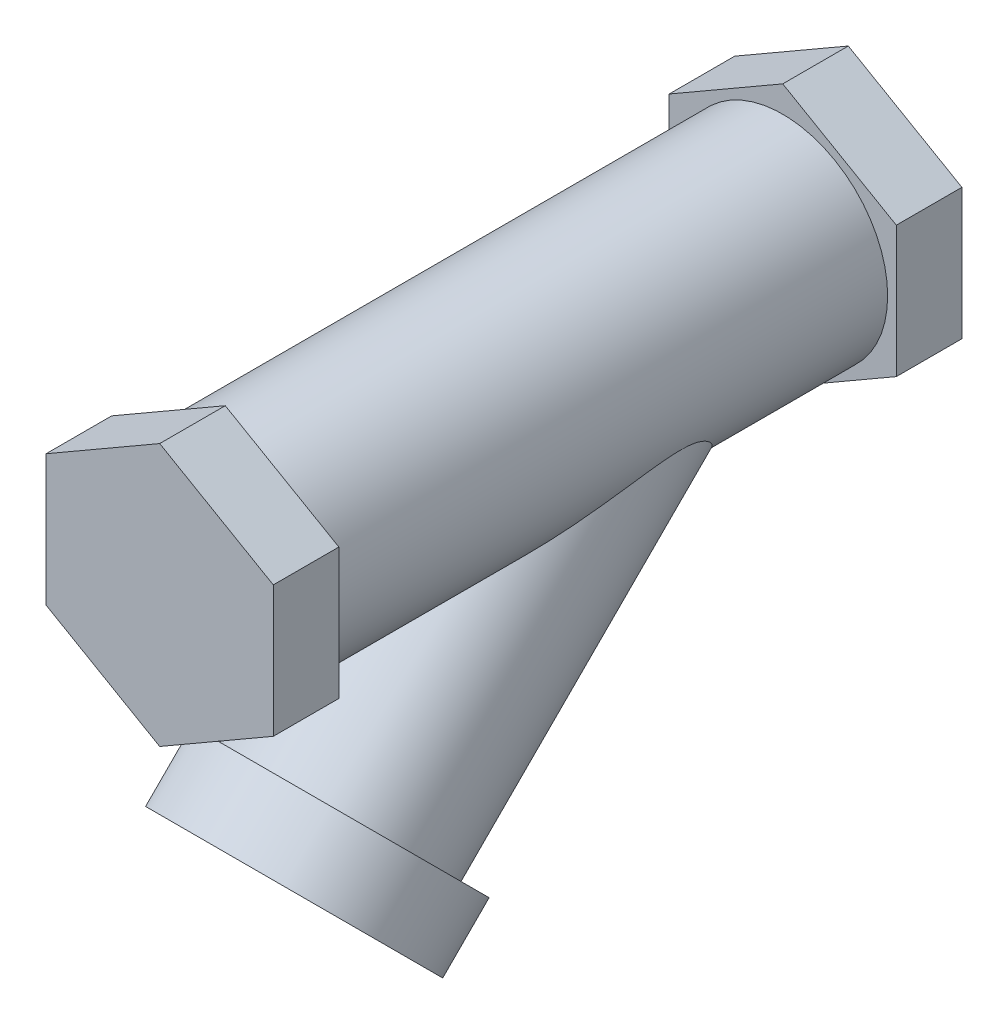
ISO-10303-21;
HEADER;
FILE_DESCRIPTION(('STEP AP214'),'2;1');
FILE_NAME('part.step','',(''),(''),'','','');
FILE_SCHEMA(('AUTOMOTIVE_DESIGN { 1 0 10303 214 1 1 1 1 }'));
ENDSEC;
DATA;
#1=APPLICATION_CONTEXT('core data for automotive mechanical design processes');
#2=APPLICATION_PROTOCOL_DEFINITION('international standard','automotive_design',2000,#1);
#3=PRODUCT_CONTEXT('',#1,'mechanical');
#4=PRODUCT('Part','Part','',(#3));
#5=PRODUCT_RELATED_PRODUCT_CATEGORY('part','',(#4));
#6=PRODUCT_DEFINITION_FORMATION('','',#4);
#7=PRODUCT_DEFINITION_CONTEXT('part definition',#1,'design');
#8=PRODUCT_DEFINITION('design','',#6,#7);
#9=PRODUCT_DEFINITION_SHAPE('','',#8);
#10=(LENGTH_UNIT() NAMED_UNIT(*) SI_UNIT(.MILLI.,.METRE.));
#11=(NAMED_UNIT(*) PLANE_ANGLE_UNIT() SI_UNIT($,.RADIAN.));
#12=(NAMED_UNIT(*) SI_UNIT($,.STERADIAN.) SOLID_ANGLE_UNIT());
#13=UNCERTAINTY_MEASURE_WITH_UNIT(LENGTH_MEASURE(1.E-05),#10,'distance_accuracy_value','');
#14=(GEOMETRIC_REPRESENTATION_CONTEXT(3) GLOBAL_UNCERTAINTY_ASSIGNED_CONTEXT((#13)) GLOBAL_UNIT_ASSIGNED_CONTEXT((#10,
#11,#12)) REPRESENTATION_CONTEXT('',''));
#15=CARTESIAN_POINT('',(0.,0.,0.));
#16=DIRECTION('',(0.,0.,1.));
#17=DIRECTION('',(1.,0.,0.));
#18=AXIS2_PLACEMENT_3D('',#15,#16,#17);
#19=CARTESIAN_POINT('',(1.77635683940025E-12,-42.4264068711926,42.426406871193));
#20=DIRECTION('',(0.,0.707106781186544,-0.707106781186551));
#21=DIRECTION('',(0.,0.707106781186552,0.707106781186544));
#22=AXIS2_PLACEMENT_3D('',#19,#20,#21);
#23=CYLINDRICAL_SURFACE('',#22,15.);
#24=CARTESIAN_POINT('',(1.77635683940025E-12,-42.4264068711926,42.426406871193));
#25=DIRECTION('',(0.,-0.707106781186544,0.707106781186551));
#26=DIRECTION('',(0.,-0.707106781186552,-0.707106781186544));
#27=AXIS2_PLACEMENT_3D('',#24,#25,#26);
#28=CIRCLE('',#27,15.);
#29=CARTESIAN_POINT('',(1.77676372927748E-12,-53.0330085889909,31.8198051533949));
#30=VERTEX_POINT('',#29);
#31=EDGE_CURVE('E154',#30,#30,#28,.T.);
#32=ORIENTED_EDGE('',*,*,#31,.F.);
#33=EDGE_LOOP('',(#32));
#34=FACE_BOUND('',#33,.T.);
#35=CARTESIAN_POINT('',(13.9283882771855,-7.87400787401188,0.));
#36=CARTESIAN_POINT('',(14.0180311252078,-7.71543650934012,0.158571707209297));
#37=CARTESIAN_POINT('',(14.10226425983,-7.56008757584001,0.323475184027694));
#38=CARTESIAN_POINT('',(14.259415917759,-7.25932865876314,0.667340434978532));
#39=CARTESIAN_POINT('',(14.3323319167353,-7.1139208966381,0.846305332194634));
#40=CARTESIAN_POINT('',(14.4661345541373,-6.83772162587846,1.21851005295413));
#41=CARTESIAN_POINT('',(14.5270595591291,-6.70688410140561,1.41170153746333));
#42=CARTESIAN_POINT('',(14.6368814971806,-6.46370973529226,1.81258221698206));
#43=CARTESIAN_POINT('',(14.6857848395825,-6.35136304587908,2.02026361054595));
#44=CARTESIAN_POINT('',(14.7636175874356,-6.16794696482968,2.40775242130768));
#45=CARTESIAN_POINT('',(14.7945763193854,-6.09309029390142,2.58536990746407));
#46=CARTESIAN_POINT('',(14.8491473758008,-5.95886579342909,2.94743815348989));
#47=CARTESIAN_POINT('',(14.8727602682607,-5.89949676640831,3.13188838380377));
#48=CARTESIAN_POINT('',(14.9132908105663,-5.79627858872174,3.50598993060031));
#49=CARTESIAN_POINT('',(14.930200854679,-5.75244707442194,3.69564689584449));
#50=CARTESIAN_POINT('',(14.9580751237754,-5.67956758108584,4.07823734433001));
#51=CARTESIAN_POINT('',(14.9690367803975,-5.65052598829184,4.27117220586321));
#52=CARTESIAN_POINT('',(14.9900158449154,-5.59471169870352,4.75548191024993));
#53=CARTESIAN_POINT('',(14.9968349503891,-5.57629640992274,5.04795586574679));
#54=CARTESIAN_POINT('',(15.0014105579259,-5.56395790855391,5.63345975533656));
#55=CARTESIAN_POINT('',(14.9991603819427,-5.57005274366655,5.92648994025681));
#56=CARTESIAN_POINT('',(14.9874467720173,-5.60149107170086,6.51264377075594));
#57=CARTESIAN_POINT('',(14.9779500251247,-5.62692345866578,6.80576158057704));
#58=CARTESIAN_POINT('',(14.9592714947531,-5.67631027879303,7.24384683327609));
#59=CARTESIAN_POINT('',(14.9523076261633,-5.69464243565639,7.38959090249462));
#60=CARTESIAN_POINT('',(14.9370212916791,-5.73461899535205,7.68055417152518));
#61=CARTESIAN_POINT('',(14.9286988339961,-5.75626337816531,7.82577337450405));
#62=CARTESIAN_POINT('',(14.902695538864,-5.8233915193518,8.24701076536955));
#63=CARTESIAN_POINT('',(14.8833679566182,-5.87270571942662,8.52231839953829));
#64=CARTESIAN_POINT('',(14.840710217756,-5.97968546242014,9.07100941352119));
#65=CARTESIAN_POINT('',(14.817379392677,-6.03735239983012,9.34439246401838));
#66=CARTESIAN_POINT('',(14.7670662751579,-6.15939202341205,9.88947843763775));
#67=CARTESIAN_POINT('',(14.740081861579,-6.22376859991735,10.1611802881806));
#68=CARTESIAN_POINT('',(14.6827165458477,-6.3579218226569,10.7028931102962));
#69=CARTESIAN_POINT('',(14.6523354361541,-6.4276987987803,10.9729039774828));
#70=CARTESIAN_POINT('',(14.556224773339,-6.64388015115676,11.7817398797512));
#71=CARTESIAN_POINT('',(14.4856345583636,-6.7968709183174,12.3182307934204));
#72=CARTESIAN_POINT('',(14.3322022644022,-7.11471708852177,13.3859210420921));
#73=CARTESIAN_POINT('',(14.249358970737,-7.27957366702117,13.9171198468956));
#74=CARTESIAN_POINT('',(14.1157552193468,-7.53357139207121,14.7118391900782));
#75=CARTESIAN_POINT('',(14.0695236304117,-7.61960275848335,14.9771279677253));
#76=CARTESIAN_POINT('',(13.9739794609624,-7.79344153431914,15.5065456662029));
#77=CARTESIAN_POINT('',(13.9246670885445,-7.88124882351502,15.7706746640853));
#78=CARTESIAN_POINT('',(13.7720518146791,-8.14691949844212,16.5614647764213));
#79=CARTESIAN_POINT('',(13.6640784986067,-8.3270168512468,17.0864829192103));
#80=CARTESIAN_POINT('',(13.4354335356812,-8.69110430010258,18.1314430543861));
#81=CARTESIAN_POINT('',(13.3147815307847,-8.87508803205078,18.6513915738121));
#82=CARTESIAN_POINT('',(13.0600084787851,-9.24590675173018,19.6869448725899));
#83=CARTESIAN_POINT('',(12.9258877811757,-9.43274166537058,20.2025497642767));
#84=CARTESIAN_POINT('',(12.6434962485285,-9.80801196794055,21.2285891941826));
#85=CARTESIAN_POINT('',(12.4952415040243,-9.99644531960927,21.7390288970093));
#86=CARTESIAN_POINT('',(12.1833947246897,-10.3742422950938,22.7548804714824));
#87=CARTESIAN_POINT('',(12.0198023714394,-10.5636059381458,23.2602922385041));
#88=CARTESIAN_POINT('',(11.6757310957643,-10.9427115959019,24.2660827082018));
#89=CARTESIAN_POINT('',(11.4952293364971,-11.1324537734791,24.7664535633455));
#90=CARTESIAN_POINT('',(11.115895301783,-11.511243861785,25.7604663603849));
#91=CARTESIAN_POINT('',(10.9170637948852,-11.7002918012773,26.2541085834106));
#92=CARTESIAN_POINT('',(10.5005967307008,-12.0754063324495,27.2296296197625));
#93=CARTESIAN_POINT('',(10.2831145978642,-12.2614846577918,27.7115691316851));
#94=CARTESIAN_POINT('',(9.82551801395284,-12.6311426545795,28.6657495244963));
#95=CARTESIAN_POINT('',(9.58539943409651,-12.8147218631827,29.1379886168694));
#96=CARTESIAN_POINT('',(9.07991657633253,-13.1776996955545,30.0690676239077));
#97=CARTESIAN_POINT('',(8.81460573002487,-13.357106205296,30.5279333142123));
#98=CARTESIAN_POINT('',(8.25441846227681,-13.7103726760433,31.4293266785134));
#99=CARTESIAN_POINT('',(7.95955811409426,-13.8842355853362,31.8718630574098));
#100=CARTESIAN_POINT('',(7.447387530743,-14.1629126039158,32.5797688290443));
#101=CARTESIAN_POINT('',(7.24031730803932,-14.2700749039536,32.8516242281428));
#102=CARTESIAN_POINT('',(6.8102135182132,-14.4802743742559,33.384257822507));
#103=CARTESIAN_POINT('',(6.58717687815061,-14.5833107444501,33.6450338699376));
#104=CARTESIAN_POINT('',(6.12366639815307,-14.78392377473,34.1522530381764));
#105=CARTESIAN_POINT('',(5.88321541860579,-14.8815073050078,34.3987142108961));
#106=CARTESIAN_POINT('',(5.38274748735754,-15.0697544357262,34.8737397767805));
#107=CARTESIAN_POINT('',(5.1227404609502,-15.1604215000449,35.1023131299588));
#108=CARTESIAN_POINT('',(4.68132895576691,-15.3008874757052,35.4561653106247));
#109=CARTESIAN_POINT('',(4.50638127591747,-15.3534080006522,35.588403354354));
#110=CARTESIAN_POINT('',(4.14764260078316,-15.454186368029,35.8420385458634));
#111=CARTESIAN_POINT('',(3.96384978084765,-15.502443325061,35.9634334419483));
#112=CARTESIAN_POINT('',(3.39906824877936,-15.6395592609074,36.3082330968229));
#113=CARTESIAN_POINT('',(3.00397162315131,-15.7209948000146,36.512835704187));
#114=CARTESIAN_POINT('',(2.42832370589892,-15.8155324124773,36.7502485324267));
#115=CARTESIAN_POINT('',(2.26143674815242,-15.840300010358,36.8124326885266));
#116=CARTESIAN_POINT('',(1.92296537656237,-15.8849388211061,36.9244897300904));
#117=CARTESIAN_POINT('',(1.75138332512228,-15.9048124478794,36.9743686850029));
#118=CARTESIAN_POINT('',(1.40446357426561,-15.9391921757097,37.060645181479));
#119=CARTESIAN_POINT('',(1.22912885639551,-15.9537023820002,37.0970530340257));
#120=CARTESIAN_POINT('',(0.875685489050642,-15.9770000307475,37.1555055897029));
#121=CARTESIAN_POINT('',(0.697576836641893,-15.985787467151,37.1775502776404));
#122=CARTESIAN_POINT('',(0.339099458995443,-15.9974159828039,37.2067216239952));
#123=CARTESIAN_POINT('',(0.15872405931228,-16.000229057787,37.2137780262305));
#124=CARTESIAN_POINT('',(-0.201961989952902,-15.9997417309704,37.2125555687197));
#125=CARTESIAN_POINT('',(-0.382272640709339,-15.9964414463063,37.2042770028003));
#126=CARTESIAN_POINT('',(-0.741429323099135,-15.983822685976,37.1726212876034));
#127=CARTESIAN_POINT('',(-0.920274615541875,-15.9745013420693,37.1492369424139));
#128=CARTESIAN_POINT('',(-1.27508607740907,-15.9501034548097,37.0880229693792));
#129=CARTESIAN_POINT('',(-1.45105166497255,-15.9350257629679,37.05019045888));
#130=CARTESIAN_POINT('',(-1.82618626807008,-15.8967265260709,36.9540755057497));
#131=CARTESIAN_POINT('',(-2.02468174701822,-15.8726002840145,36.8935205828844));
#132=CARTESIAN_POINT('',(-2.4150246195687,-15.8179189196865,36.7562409257037));
#133=CARTESIAN_POINT('',(-2.60687086083817,-15.787362689503,36.6795134047833));
#134=CARTESIAN_POINT('',(-3.17178150377204,-15.6871302778014,36.4277518792202));
#135=CARTESIAN_POINT('',(-3.53389909682731,-15.6089250189522,36.2312257851009));
#136=CARTESIAN_POINT('',(-4.15137264610286,-15.4545971225192,35.8430866206617));
#137=CARTESIAN_POINT('',(-4.41287589776344,-15.381685016319,35.6596108093765));
#138=CARTESIAN_POINT('',(-4.9177872073443,-15.2277698292711,35.2720147601118));
#139=CARTESIAN_POINT('',(-5.16118397606584,-15.1467617732266,35.0678818267509));
#140=CARTESIAN_POINT('',(-5.63131879622187,-14.9783421134201,34.6431257172821));
#141=CARTESIAN_POINT('',(-5.85803042674721,-14.890920773433,34.4224774579435));
#142=CARTESIAN_POINT('',(-6.29601524541186,-14.7110922291618,33.9681723808527));
#143=CARTESIAN_POINT('',(-6.50728237883612,-14.6186830939267,33.7345105239484));
#144=CARTESIAN_POINT('',(-6.9157448337387,-14.4299371908676,33.2567596538149));
#145=CARTESIAN_POINT('',(-7.11293970195528,-14.3336002966889,33.0126703051251));
#146=CARTESIAN_POINT('',(-7.49456283781941,-14.1378041217358,32.5160105797937));
#147=CARTESIAN_POINT('',(-7.67899271780274,-14.0383452376127,32.263441280255));
#148=CARTESIAN_POINT('',(-8.03646642794623,-13.8368111541617,31.7510107291257));
#149=CARTESIAN_POINT('',(-8.20949903217319,-13.7347335089515,31.4911426373886));
#150=CARTESIAN_POINT('',(-8.54502625428846,-13.528536332139,30.9654755078271));
#151=CARTESIAN_POINT('',(-8.70752015962158,-13.4244166630873,30.6996760705951));
#152=CARTESIAN_POINT('',(-9.02341520496351,-13.2141630955955,30.1621101887644));
#153=CARTESIAN_POINT('',(-9.17678206817543,-13.1080233650773,29.8903259310825));
#154=CARTESIAN_POINT('',(-9.474569713036,-12.8944203034697,29.342437529356));
#155=CARTESIAN_POINT('',(-9.61899066866886,-12.7869569981707,29.0663334694558));
#156=CARTESIAN_POINT('',(-10.0397400322477,-12.4631078521593,28.2327116183548));
#157=CARTESIAN_POINT('',(-10.3037406730084,-12.2451373365849,27.669563701109));
#158=CARTESIAN_POINT('',(-10.8456775696984,-11.7695514862158,26.4351788783503));
#159=CARTESIAN_POINT('',(-11.1183647958387,-11.5114906396145,25.7618291423135));
#160=CARTESIAN_POINT('',(-11.6301071365295,-10.9942202952996,24.4027691418271));
#161=CARTESIAN_POINT('',(-11.8691534482017,-10.7350105151777,23.7170556949013));
#162=CARTESIAN_POINT('',(-12.3178193223018,-10.2170859981904,22.3344570892646));
#163=CARTESIAN_POINT('',(-12.5273872032284,-9.95837289619821,21.637554638961));
#164=CARTESIAN_POINT('',(-12.9194932620896,-9.4441082514856,20.2351857248136));
#165=CARTESIAN_POINT('',(-13.1020350754868,-9.18855628778484,19.5297204266562));
#166=CARTESIAN_POINT('',(-13.4415844740014,-8.68422367354116,18.1135558591401));
#167=CARTESIAN_POINT('',(-13.5986897220876,-8.43542033247564,17.4028881145466));
#168=CARTESIAN_POINT('',(-13.816889061444,-8.06931139630673,16.3308432013764));
#169=CARTESIAN_POINT('',(-13.8867210031029,-7.94844128046591,15.972436901457));
#170=CARTESIAN_POINT('',(-14.0206538604404,-7.70973320541579,15.2535523460965));
#171=CARTESIAN_POINT('',(-14.0847549030186,-7.59189517910788,14.8930741367219));
#172=CARTESIAN_POINT('',(-14.2071658429383,-7.36026923185675,14.1705905931416));
#173=CARTESIAN_POINT('',(-14.2654862006318,-7.24647424356916,13.8085893004159));
#174=CARTESIAN_POINT('',(-14.3764479040492,-7.02376088978122,13.0822330422601));
#175=CARTESIAN_POINT('',(-14.429089482527,-6.91484232451998,12.7178781739445));
#176=CARTESIAN_POINT('',(-14.5285632299147,-6.70332015762137,11.9867038731872));
#177=CARTESIAN_POINT('',(-14.5753976899155,-6.60071407361335,11.6198854732861));
#178=CARTESIAN_POINT('',(-14.6630335286729,-6.40367518346042,10.8833605478064));
#179=CARTESIAN_POINT('',(-14.7038356492673,-6.30924137290896,10.5136543832527));
#180=CARTESIAN_POINT('',(-14.7555135192723,-6.18677207096566,10.0026945212377));
#181=CARTESIAN_POINT('',(-14.7691766093626,-6.15407269092241,9.86283396244396));
#182=CARTESIAN_POINT('',(-14.7955467274515,-6.09040092082723,9.58263041793712));
#183=CARTESIAN_POINT('',(-14.8082537538808,-6.05942853361027,9.44228743143244));
#184=CARTESIAN_POINT('',(-14.8448809475063,-5.96939703948958,9.02049508514711));
#185=CARTESIAN_POINT('',(-14.8673067569242,-5.91322472574364,8.73828697900112));
#186=CARTESIAN_POINT('',(-14.9077816153239,-5.81043138009273,8.17075490847215));
#187=CARTESIAN_POINT('',(-14.9258147813723,-5.76384510093662,7.88542342397418));
#188=CARTESIAN_POINT('',(-14.9567041878428,-5.68320954448,7.31264709895928));
#189=CARTESIAN_POINT('',(-14.9695600946837,-5.64916107502789,7.02520212348052));
#190=CARTESIAN_POINT('',(-14.9892621233298,-5.59668137495333,6.44279531999777));
#191=CARTESIAN_POINT('',(-14.9959829116892,-5.57857609647756,6.14779813011593));
#192=CARTESIAN_POINT('',(-15.0013834214074,-5.56404536777675,5.55698537473641));
#193=CARTESIAN_POINT('',(-15.0000615568297,-5.56762419345494,5.26116965932889));
#194=CARTESIAN_POINT('',(-14.987221939682,-5.60210399011295,4.67338147440921));
#195=CARTESIAN_POINT('',(-14.9757804828332,-5.63280050772514,4.38139680595294));
#196=CARTESIAN_POINT('',(-14.9401178667331,-5.72673406603803,3.80354282122821));
#197=CARTESIAN_POINT('',(-14.9159126032005,-5.78993062959523,3.51766635770745));
#198=CARTESIAN_POINT('',(-14.8635412019633,-5.92267953354277,3.05829170972969));
#199=CARTESIAN_POINT('',(-14.8399023437149,-5.98183991075391,2.88123172711169));
#200=CARTESIAN_POINT('',(-14.7857470096167,-6.11447772757753,2.53363391330137));
#201=CARTESIAN_POINT('',(-14.7552311145963,-6.18795395801257,2.3630955327213));
#202=CARTESIAN_POINT('',(-14.6869478087562,-6.34831742425844,2.02969990185006));
#203=CARTESIAN_POINT('',(-14.649171212302,-6.43522162041019,1.86685271041962));
#204=CARTESIAN_POINT('',(-14.5663033442571,-6.62066006090288,1.54993705942919));
#205=CARTESIAN_POINT('',(-14.5212120113186,-6.71919440278266,1.3958686735107));
#206=CARTESIAN_POINT('',(-14.3981730967543,-6.98017214217104,1.018243095526));
#207=CARTESIAN_POINT('',(-14.3154000165553,-7.14902091460435,0.800642193688347));
#208=CARTESIAN_POINT('',(-14.1791931694312,-7.41352801841959,0.489500748702578));
#209=CARTESIAN_POINT('',(-14.1317783559901,-7.50357771937119,0.388322094603767));
#210=CARTESIAN_POINT('',(-14.0330103211415,-7.68670466023873,0.190685271329829));
#211=CARTESIAN_POINT('',(-13.9816564851775,-7.77978237126758,0.0942278426100905));
#212=CARTESIAN_POINT('',(-13.8540687774391,-8.00547075760565,-0.13146614816117));
#213=CARTESIAN_POINT('',(-13.7760228240586,-8.13916789480477,-0.258592257326699));
#214=CARTESIAN_POINT('',(-13.6127443036771,-8.40941014862885,-0.504989312695234));
#215=CARTESIAN_POINT('',(-13.5275096026611,-8.545956101821,-0.624257907509045));
#216=CARTESIAN_POINT('',(-13.2612082862781,-8.95807436244921,-0.971686890868053));
#217=CARTESIAN_POINT('',(-13.0696726480815,-9.23589686087947,-1.18924789586288));
#218=CARTESIAN_POINT('',(-12.6596084528644,-9.79050844267549,-1.60195887511543));
#219=CARTESIAN_POINT('',(-12.4409657053732,-10.0672877196181,-1.79700686486201));
#220=CARTESIAN_POINT('',(-11.9788101675446,-10.6130059528018,-2.16715305374523));
#221=CARTESIAN_POINT('',(-11.7353093202937,-10.8819485950623,-2.34226074845334));
#222=CARTESIAN_POINT('',(-11.2271438480482,-11.405396599667,-2.67335209900063));
#223=CARTESIAN_POINT('',(-10.9627062532326,-11.6600162815888,-2.82950407101935));
#224=CARTESIAN_POINT('',(-10.4119392284372,-12.1543602699098,-3.12605490084303));
#225=CARTESIAN_POINT('',(-10.1256082976118,-12.3940835530763,-3.26645267702573));
#226=CARTESIAN_POINT('',(-9.53300533611363,-12.8554493220492,-3.53206931926108));
#227=CARTESIAN_POINT('',(-9.22676945208705,-13.0771230218866,-3.65731457979817));
#228=CARTESIAN_POINT('',(-8.59546584078702,-13.5004601858803,-3.89332892189614));
#229=CARTESIAN_POINT('',(-8.27039807482599,-13.7021236089259,-4.00409797371606));
#230=CARTESIAN_POINT('',(-7.57340121351409,-14.100307759845,-4.22055062436302));
#231=CARTESIAN_POINT('',(-7.19987734848879,-14.2947695898563,-4.32490190642228));
#232=CARTESIAN_POINT('',(-6.43501317245752,-14.6550103831332,-4.51658061558673));
#233=CARTESIAN_POINT('',(-6.04367162459317,-14.8207873513222,-4.60390685862753));
#234=CARTESIAN_POINT('',(-5.24582253397284,-15.1216127138682,-4.76138498863694));
#235=CARTESIAN_POINT('',(-4.83930947321311,-15.2566497985722,-4.83153055530176));
#236=CARTESIAN_POINT('',(-4.01432141655707,-15.4941749069494,-4.9543742587151));
#237=CARTESIAN_POINT('',(-3.59584710364736,-15.5966647850347,-5.00707338950038));
#238=CARTESIAN_POINT('',(-2.76846676160197,-15.7640726706298,-5.09291409289651));
#239=CARTESIAN_POINT('',(-2.35992695917812,-15.8304210019244,-5.12680141366567));
#240=CARTESIAN_POINT('',(-1.53792051786406,-15.9312978597243,-5.17825485771454));
#241=CARTESIAN_POINT('',(-1.12445400170669,-15.9658271772239,-5.19582138671563));
#242=CARTESIAN_POINT('',(-0.295813155957194,-16.0026391796027,-5.21454756862238));
#243=CARTESIAN_POINT('',(0.119360761488934,-16.0049292365164,-5.21571097237111));
#244=CARTESIAN_POINT('',(0.948349465831524,-15.9772532229522,-5.20163474644804));
#245=CARTESIAN_POINT('',(1.36216427338373,-15.9472876449921,-5.18639536723357));
#246=CARTESIAN_POINT('',(2.17251784360571,-15.8568974011646,-5.14031529991635));
#247=CARTESIAN_POINT('',(2.56919420449402,-15.7974468540225,-5.1099734555488));
#248=CARTESIAN_POINT('',(3.35555458672584,-15.6492914786135,-5.0340889196925));
#249=CARTESIAN_POINT('',(3.74523878638317,-15.5605873974903,-4.98854661642747));
#250=CARTESIAN_POINT('',(4.51487746937762,-15.3549504346371,-4.88244468715608));
#251=CARTESIAN_POINT('',(4.89483441396029,-15.2380247733566,-4.82188890221921));
#252=CARTESIAN_POINT('',(5.64264742191663,-14.977227609485,-4.68593705886761));
#253=CARTESIAN_POINT('',(6.0105032988345,-14.8333556919287,-4.61054077191218));
#254=CARTESIAN_POINT('',(6.73691666304715,-14.5180210226416,-4.44389759538032));
#255=CARTESIAN_POINT('',(7.09526945810652,-14.3461973034823,-4.35244188701111));
#256=CARTESIAN_POINT('',(7.79499996724203,-13.9783481728527,-4.15451753236351));
#257=CARTESIAN_POINT('',(8.13637730452313,-13.7823222245147,-4.04804855304471));
#258=CARTESIAN_POINT('',(8.80071665466853,-13.3679051892317,-3.81985787046281));
#259=CARTESIAN_POINT('',(9.12364892317758,-13.1494794824328,-3.69811248987489));
#260=CARTESIAN_POINT('',(9.74874332638625,-12.6929819092159,-3.43920206611037));
#261=CARTESIAN_POINT('',(10.0509061391527,-12.4549106847301,-3.30203752671347));
#262=CARTESIAN_POINT('',(10.647485791686,-11.9495341992814,-3.00432920534803));
#263=CARTESIAN_POINT('',(10.9407572606562,-11.6813620349477,-2.84295869528368));
#264=CARTESIAN_POINT('',(11.50109512646,-11.1301101112092,-2.50096869377194));
#265=CARTESIAN_POINT('',(11.7681523244262,-10.8470251719207,-2.32034249134957));
#266=CARTESIAN_POINT('',(12.2734102080635,-10.2717644506428,-1.93815199627099));
#267=CARTESIAN_POINT('',(12.5117209991334,-9.97962911672479,-1.73667346893981));
#268=CARTESIAN_POINT('',(12.8470423074628,-9.53874711302177,-1.41554367377733));
#269=CARTESIAN_POINT('',(12.9550955922369,-9.39138543344111,-1.30538499591288));
#270=CARTESIAN_POINT('',(13.1636494761073,-9.09675011535401,-1.07804652920215));
#271=CARTESIAN_POINT('',(13.2641512931676,-8.94947646646695,-0.960867878099429));
#272=CARTESIAN_POINT('',(13.4644933100073,-8.64540133002449,-0.709757335578128));
#273=CARTESIAN_POINT('',(13.5637373837379,-8.48869874327623,-0.575227258774956));
#274=CARTESIAN_POINT('',(13.7530928833976,-8.17835811402917,-0.295719439952727));
#275=CARTESIAN_POINT('',(13.8431842005578,-8.02472739045422,-0.150719842018727));
#276=CARTESIAN_POINT('',(13.9283882771855,-7.87400787401188,0.));
#277=B_SPLINE_CURVE_WITH_KNOTS('',3,(#35,#36,#37,#38,#39,#40,#41,#42,#43,#44,#45,#46,#47,#48,
#49,#50,#51,#52,#53,#54,#55,#56,#57,#58,#59,#60,#61,#62,#63,#64,#65,#66,#67,#68,#69,#70,#71,#72,
#73,#74,#75,#76,#77,#78,#79,#80,#81,#82,#83,#84,#85,#86,#87,#88,#89,#90,#91,#92,#93,#94,#95,#96,
#97,#98,#99,#100,#101,#102,#103,#104,#105,#106,#107,#108,#109,#110,#111,#112,#113,#114,#115,
#116,#117,#118,#119,#120,#121,#122,#123,#124,#125,#126,#127,#128,#129,#130,#131,#132,#133,#134,
#135,#136,#137,#138,#139,#140,#141,#142,#143,#144,#145,#146,#147,#148,#149,#150,#151,#152,#153,
#154,#155,#156,#157,#158,#159,#160,#161,#162,#163,#164,#165,#166,#167,#168,#169,#170,#171,#172,
#173,#174,#175,#176,#177,#178,#179,#180,#181,#182,#183,#184,#185,#186,#187,#188,#189,#190,#191,
#192,#193,#194,#195,#196,#197,#198,#199,#200,#201,#202,#203,#204,#205,#206,#207,#208,#209,#210,
#211,#212,#213,#214,#215,#216,#217,#218,#219,#220,#221,#222,#223,#224,#225,#226,#227,#228,#229,
#230,#231,#232,#233,#234,#235,#236,#237,#238,#239,#240,#241,#242,#243,#244,#245,#246,#247,#248,
#249,#250,#251,#252,#253,#254,#255,#256,#257,#258,#259,#260,#261,#262,#263,#264,#265,#266,#267,
#268,#269,#270,#271,#272,#273,#274,#275,#276),.UNSPECIFIED.,.T.,.F.,(4,2,2,2,2,2,2,2,2,2,2,2,2,
2,2,2,2,2,2,2,2,2,2,2,2,2,2,2,2,2,2,2,2,2,2,2,2,2,2,2,2,2,2,2,2,2,2,2,2,2,2,2,2,2,2,2,2,2,2,2,2,
2,2,2,2,2,2,2,2,2,2,2,2,2,2,2,2,2,2,2,2,2,2,2,2,2,2,2,2,2,2,2,2,2,2,2,2,2,2,2,2,2,2,2,2,2,2,2,2,
2,2,2,2,2,2,2,2,2,2,2,4),(0.,0.724359125298077,1.44887959019842,2.17104277281426,
2.89282009542524,3.47761981982555,4.06237431515462,4.64779044585828,5.23345914356159,
6.11126112329945,6.98970957904591,7.87222083021155,8.31336018416335,8.7544968719833,
9.59534767618666,10.4363390227644,11.2778207283812,12.1193538774351,13.8059348814507,
15.4926831927791,16.3407486156874,17.1887568165268,18.8849202805142,20.5784937236058,
22.2720232321941,23.963647299505,25.6553064939442,27.3492842174147,29.043190946253,
30.7242993600525,32.4057149955763,34.0836408660955,35.7606589432945,36.834646198183,
37.9088407142087,38.9816498029031,40.05391803522,40.7299678954806,41.4061578198998,
42.7557279200625,43.2947417318054,43.8334891450473,44.3718233357205,44.9101580958273,
45.4510107310751,45.9918530033788,46.5329531058911,47.0741612234997,47.699984798316,
48.3259162933799,49.5787631368971,50.5605357473429,51.5429154394503,52.5268186740128,
53.5111055829303,54.495424181019,55.4796182228361,56.4647675978435,57.4499835126639,
58.4386921024182,59.4273814572635,61.4035887493801,63.7154505086322,66.027916096505,
68.3443866664879,70.660545348389,72.9675887637413,74.1214347388909,75.2752551580126,
76.4269480475006,77.5785937150585,78.7297835666303,79.8808317306226,80.3136615652059,
80.7464921102832,81.6121675896629,82.4809282037292,83.3497447848359,84.235937082623,
85.1223041349576,86.0020449342846,86.8806927054566,87.4444940367572,88.0082477676433,
88.5727194640365,89.1371958948351,89.9978560822708,90.4282612438244,90.8587336932675,
91.4593263976126,92.0600980226452,93.262671087075,94.4704941310349,95.6777395827556,
96.8733293133159,98.0690010782935,99.2625591374479,100.456119648695,101.756018153118,
103.05600703119,104.35647342396,105.656865707957,106.901149424624,108.145402208598,
109.389370469193,110.633319735661,111.838664616666,113.043978715201,114.24898476218,
115.454009367457,116.676052465827,117.898122677128,119.122110963903,120.346059271756,
121.631290873518,122.916971876458,124.197560549208,124.837463498765,125.477263016856,
126.164276501273,126.852768129768),.UNSPECIFIED.);
#278=CARTESIAN_POINT('',(13.9283882771855,-7.87400787401188,0.));
#279=VERTEX_POINT('',#278);
#280=EDGE_CURVE('E49',#279,#279,#277,.T.);
#281=ORIENTED_EDGE('',*,*,#280,.T.);
#282=EDGE_LOOP('',(#281));
#283=FACE_BOUND('',#282,.T.);
#284=ADVANCED_FACE('F39',(#34,#283),#23,.T.);
#285=CARTESIAN_POINT('',(1.77635683940025E-12,0.,60.0000000000001));
#286=DIRECTION('',(0.,0.,-1.));
#287=DIRECTION('',(-1.,0.,0.));
#288=AXIS2_PLACEMENT_3D('',#285,#286,#287);
#289=CYLINDRICAL_SURFACE('',#288,16.);
#290=CARTESIAN_POINT('',(1.77635683940025E-12,0.,60.0000000000001));
#291=DIRECTION('',(0.,0.,1.));
#292=DIRECTION('',(1.,0.,0.));
#293=AXIS2_PLACEMENT_3D('',#290,#291,#292);
#294=CIRCLE('',#293,16.);
#295=CARTESIAN_POINT('',(16.0000000000018,0.,60.0000000000001));
#296=VERTEX_POINT('',#295);
#297=EDGE_CURVE('E11',#296,#296,#294,.T.);
#298=ORIENTED_EDGE('',*,*,#297,.F.);
#299=EDGE_LOOP('',(#298));
#300=FACE_BOUND('',#299,.T.);
#301=ORIENTED_EDGE('',*,*,#280,.F.);
#302=EDGE_LOOP('',(#301));
#303=FACE_BOUND('',#302,.T.);
#304=CARTESIAN_POINT('',(1.77635683940025E-12,0.,-24.9999999999999));
#305=DIRECTION('',(0.,0.,-1.));
#306=DIRECTION('',(-1.,0.,0.));
#307=AXIS2_PLACEMENT_3D('',#304,#305,#306);
#308=CIRCLE('',#307,16.);
#309=CARTESIAN_POINT('',(-15.9999999999982,0.,-24.9999999999999));
#310=VERTEX_POINT('',#309);
#311=EDGE_CURVE('E134',#310,#310,#308,.T.);
#312=ORIENTED_EDGE('',*,*,#311,.F.);
#313=EDGE_LOOP('',(#312));
#314=FACE_BOUND('',#313,.T.);
#315=ADVANCED_FACE('F41',(#300,#303,#314),#289,.T.);
#316=CARTESIAN_POINT('',(1.77635683940025E-12,-42.4264068711927,42.426406871193));
#317=DIRECTION('',(0.,-0.707106781186545,0.707106781186551));
#318=DIRECTION('',(0.,-0.707106781186551,-0.707106781186544));
#319=AXIS2_PLACEMENT_3D('',#316,#317,#318);
#320=PLANE('',#319);
#321=CARTESIAN_POINT('',(1.77635683940025E-12,-42.4264068711927,42.426406871193));
#322=DIRECTION('',(0.,-0.707106781186545,0.707106781186551));
#323=DIRECTION('',(0.,-0.707106781186551,-0.707106781186544));
#324=AXIS2_PLACEMENT_3D('',#321,#322,#323);
#325=CIRCLE('',#324,18.5);
#326=CARTESIAN_POINT('',(1.77685867024883E-12,-55.5078823231439,29.344931419242));
#327=VERTEX_POINT('',#326);
#328=EDGE_CURVE('E150',#327,#327,#325,.T.);
#329=ORIENTED_EDGE('',*,*,#328,.F.);
#330=EDGE_LOOP('',(#329));
#331=FACE_BOUND('',#330,.T.);
#332=ORIENTED_EDGE('',*,*,#31,.T.);
#333=EDGE_LOOP('',(#332));
#334=FACE_BOUND('',#333,.T.);
#335=ADVANCED_FACE('F169',(#331,#334),#320,.F.);
#336=CARTESIAN_POINT('',(1.77635683940025E-12,-49.4974746830581,49.4974746830588));
#337=DIRECTION('',(0.,0.707106781186545,-0.707106781186551));
#338=DIRECTION('',(0.,0.707106781186551,0.707106781186544));
#339=AXIS2_PLACEMENT_3D('',#336,#337,#338);
#340=CYLINDRICAL_SURFACE('',#339,18.5);
#341=CARTESIAN_POINT('',(1.77635683940025E-12,-49.4974746830581,49.4974746830588));
#342=DIRECTION('',(0.,-0.707106781186545,0.707106781186551));
#343=DIRECTION('',(0.,-0.707106781186551,-0.707106781186544));
#344=AXIS2_PLACEMENT_3D('',#341,#342,#343);
#345=CIRCLE('',#344,18.5);
#346=CARTESIAN_POINT('',(1.77685867024883E-12,-62.5789501350093,36.4159992311077));
#347=VERTEX_POINT('',#346);
#348=EDGE_CURVE('E151',#347,#347,#345,.T.);
#349=ORIENTED_EDGE('',*,*,#348,.F.);
#350=EDGE_LOOP('',(#349));
#351=FACE_BOUND('',#350,.T.);
#352=ORIENTED_EDGE('',*,*,#328,.T.);
#353=EDGE_LOOP('',(#352));
#354=FACE_BOUND('',#353,.T.);
#355=ADVANCED_FACE('F165',(#351,#354),#340,.T.);
#356=CARTESIAN_POINT('',(1.77635683940025E-12,-49.4974746830581,49.4974746830588));
#357=DIRECTION('',(0.,-0.707106781186545,0.707106781186551));
#358=DIRECTION('',(0.,-0.707106781186551,-0.707106781186544));
#359=AXIS2_PLACEMENT_3D('',#356,#357,#358);
#360=PLANE('',#359);
#361=ORIENTED_EDGE('',*,*,#348,.T.);
#362=EDGE_LOOP('',(#361));
#363=FACE_BOUND('',#362,.T.);
#364=ADVANCED_FACE('F168',(#363),#360,.T.);
#365=CARTESIAN_POINT('',(-17.3205080756871,30.,60.0000000000001));
#366=DIRECTION('',(0.,0.,1.));
#367=DIRECTION('',(1.,0.,0.));
#368=AXIS2_PLACEMENT_3D('',#365,#366,#367);
#369=PLANE('',#368);
#370=DIRECTION('',(-0.86602540378444,0.5,0.));
#371=VECTOR('',#370,1.);
#372=CARTESIAN_POINT('',(17.3205080756906,10.,60.0000000000001));
#373=LINE('',#372,#371);
#374=CARTESIAN_POINT('',(17.3205080756906,10.,60.0000000000001));
#375=VERTEX_POINT('',#374);
#376=CARTESIAN_POINT('',(1.77635683940025E-12,20.,60.0000000000001));
#377=VERTEX_POINT('',#376);
#378=EDGE_CURVE('E130',#375,#377,#373,.T.);
#379=ORIENTED_EDGE('',*,*,#378,.F.);
#380=DIRECTION('',(0.,1.,0.));
#381=VECTOR('',#380,1.);
#382=CARTESIAN_POINT('',(17.3205080756906,-10.,60.0000000000001));
#383=LINE('',#382,#381);
#384=CARTESIAN_POINT('',(17.3205080756906,-10.,60.0000000000001));
#385=VERTEX_POINT('',#384);
#386=EDGE_CURVE('E87',#385,#375,#383,.T.);
#387=ORIENTED_EDGE('',*,*,#386,.F.);
#388=DIRECTION('',(0.866025403784439,0.5,0.));
#389=VECTOR('',#388,1.);
#390=CARTESIAN_POINT('',(1.77635683940025E-12,-20.,60.0000000000001));
#391=LINE('',#390,#389);
#392=CARTESIAN_POINT('',(1.77635683940025E-12,-20.,60.0000000000001));
#393=VERTEX_POINT('',#392);
#394=EDGE_CURVE('E81',#393,#385,#391,.T.);
#395=ORIENTED_EDGE('',*,*,#394,.F.);
#396=DIRECTION('',(0.866025403784439,-0.5,0.));
#397=VECTOR('',#396,1.);
#398=CARTESIAN_POINT('',(-17.3205080756871,-10.,60.0000000000001));
#399=LINE('',#398,#397);
#400=CARTESIAN_POINT('',(-17.3205080756871,-10.,60.0000000000001));
#401=VERTEX_POINT('',#400);
#402=EDGE_CURVE('E120',#401,#393,#399,.T.);
#403=ORIENTED_EDGE('',*,*,#402,.F.);
#404=DIRECTION('',(0.,-1.,0.));
#405=VECTOR('',#404,1.);
#406=CARTESIAN_POINT('',(-17.3205080756871,10.,60.0000000000001));
#407=LINE('',#406,#405);
#408=CARTESIAN_POINT('',(-17.3205080756871,10.,60.0000000000001));
#409=VERTEX_POINT('',#408);
#410=EDGE_CURVE('E136',#409,#401,#407,.T.);
#411=ORIENTED_EDGE('',*,*,#410,.F.);
#412=DIRECTION('',(-0.866025403784439,-0.5,0.));
#413=VECTOR('',#412,1.);
#414=CARTESIAN_POINT('',(1.77635683940025E-12,20.,60.0000000000001));
#415=LINE('',#414,#413);
#416=EDGE_CURVE('E133',#377,#409,#415,.T.);
#417=ORIENTED_EDGE('',*,*,#416,.F.);
#418=EDGE_LOOP('',(#379,#387,#395,#403,#411,#417));
#419=FACE_BOUND('',#418,.T.);
#420=ORIENTED_EDGE('',*,*,#297,.T.);
#421=EDGE_LOOP('',(#420));
#422=FACE_BOUND('',#421,.T.);
#423=ADVANCED_FACE('F176',(#419,#422),#369,.F.);
#424=CARTESIAN_POINT('',(17.3205080756906,10.,69.9999999999998));
#425=DIRECTION('',(-0.5,-0.866025403784439,0.));
#426=DIRECTION('',(0.86602540378444,-0.5,0.));
#427=AXIS2_PLACEMENT_3D('',#424,#425,#426);
#428=PLANE('',#427);
#429=ORIENTED_EDGE('',*,*,#378,.T.);
#430=DIRECTION('',(0.,0.,-1.));
#431=VECTOR('',#430,1.);
#432=CARTESIAN_POINT('',(1.77635683940025E-12,20.,69.9999999999998));
#433=LINE('',#432,#431);
#434=CARTESIAN_POINT('',(1.77635683940025E-12,20.,69.9999999999998));
#435=VERTEX_POINT('',#434);
#436=EDGE_CURVE('E148',#435,#377,#433,.T.);
#437=ORIENTED_EDGE('',*,*,#436,.F.);
#438=DIRECTION('',(-0.86602540378444,0.5,0.));
#439=VECTOR('',#438,1.);
#440=CARTESIAN_POINT('',(17.3205080756906,10.,69.9999999999998));
#441=LINE('',#440,#439);
#442=CARTESIAN_POINT('',(17.3205080756906,10.,69.9999999999998));
#443=VERTEX_POINT('',#442);
#444=EDGE_CURVE('E141',#443,#435,#441,.T.);
#445=ORIENTED_EDGE('',*,*,#444,.F.);
#446=DIRECTION('',(0.,0.,-1.));
#447=VECTOR('',#446,1.);
#448=CARTESIAN_POINT('',(17.3205080756906,10.,69.9999999999998));
#449=LINE('',#448,#447);
#450=EDGE_CURVE('E126',#443,#375,#449,.T.);
#451=ORIENTED_EDGE('',*,*,#450,.T.);
#452=EDGE_LOOP('',(#429,#437,#445,#451));
#453=FACE_BOUND('',#452,.T.);
#454=ADVANCED_FACE('F178',(#453),#428,.F.);
#455=CARTESIAN_POINT('',(1.77635683940025E-12,20.,69.9999999999998));
#456=DIRECTION('',(0.5,-0.866025403784439,0.));
#457=DIRECTION('',(0.86602540378444,0.5,0.));
#458=AXIS2_PLACEMENT_3D('',#455,#456,#457);
#459=PLANE('',#458);
#460=ORIENTED_EDGE('',*,*,#416,.T.);
#461=DIRECTION('',(0.,0.,-1.));
#462=VECTOR('',#461,1.);
#463=CARTESIAN_POINT('',(-17.3205080756871,10.,69.9999999999998));
#464=LINE('',#463,#462);
#465=CARTESIAN_POINT('',(-17.3205080756871,10.,69.9999999999998));
#466=VERTEX_POINT('',#465);
#467=EDGE_CURVE('E145',#466,#409,#464,.T.);
#468=ORIENTED_EDGE('',*,*,#467,.F.);
#469=DIRECTION('',(-0.866025403784439,-0.5,0.));
#470=VECTOR('',#469,1.);
#471=CARTESIAN_POINT('',(1.77635683940025E-12,20.,69.9999999999998));
#472=LINE('',#471,#470);
#473=EDGE_CURVE('E96',#435,#466,#472,.T.);
#474=ORIENTED_EDGE('',*,*,#473,.F.);
#475=ORIENTED_EDGE('',*,*,#436,.T.);
#476=EDGE_LOOP('',(#460,#468,#474,#475));
#477=FACE_BOUND('',#476,.T.);
#478=ADVANCED_FACE('F181',(#477),#459,.F.);
#479=CARTESIAN_POINT('',(-17.3205080756871,10.,69.9999999999998));
#480=DIRECTION('',(1.,0.,0.));
#481=DIRECTION('',(0.,1.,0.));
#482=AXIS2_PLACEMENT_3D('',#479,#480,#481);
#483=PLANE('',#482);
#484=ORIENTED_EDGE('',*,*,#410,.T.);
#485=DIRECTION('',(0.,0.,-1.));
#486=VECTOR('',#485,1.);
#487=CARTESIAN_POINT('',(-17.3205080756871,-10.,69.9999999999998));
#488=LINE('',#487,#486);
#489=CARTESIAN_POINT('',(-17.3205080756871,-10.,69.9999999999998));
#490=VERTEX_POINT('',#489);
#491=EDGE_CURVE('E121',#490,#401,#488,.T.);
#492=ORIENTED_EDGE('',*,*,#491,.F.);
#493=DIRECTION('',(0.,-1.,0.));
#494=VECTOR('',#493,1.);
#495=CARTESIAN_POINT('',(-17.3205080756871,10.,69.9999999999998));
#496=LINE('',#495,#494);
#497=EDGE_CURVE('E112',#466,#490,#496,.T.);
#498=ORIENTED_EDGE('',*,*,#497,.F.);
#499=ORIENTED_EDGE('',*,*,#467,.T.);
#500=EDGE_LOOP('',(#484,#492,#498,#499));
#501=FACE_BOUND('',#500,.T.);
#502=ADVANCED_FACE('F185',(#501),#483,.F.);
#503=CARTESIAN_POINT('',(-17.3205080756871,-10.,69.9999999999998));
#504=DIRECTION('',(0.5,0.866025403784439,0.));
#505=DIRECTION('',(-0.86602540378444,0.500000000000001,0.));
#506=AXIS2_PLACEMENT_3D('',#503,#504,#505);
#507=PLANE('',#506);
#508=ORIENTED_EDGE('',*,*,#402,.T.);
#509=DIRECTION('',(0.,0.,-1.));
#510=VECTOR('',#509,1.);
#511=CARTESIAN_POINT('',(1.77635683940025E-12,-20.,69.9999999999998));
#512=LINE('',#511,#510);
#513=CARTESIAN_POINT('',(1.77635683940025E-12,-20.,69.9999999999998));
#514=VERTEX_POINT('',#513);
#515=EDGE_CURVE('E117',#514,#393,#512,.T.);
#516=ORIENTED_EDGE('',*,*,#515,.F.);
#517=DIRECTION('',(0.866025403784439,-0.5,0.));
#518=VECTOR('',#517,1.);
#519=CARTESIAN_POINT('',(-17.3205080756871,-10.,69.9999999999998));
#520=LINE('',#519,#518);
#521=EDGE_CURVE('E106',#490,#514,#520,.T.);
#522=ORIENTED_EDGE('',*,*,#521,.F.);
#523=ORIENTED_EDGE('',*,*,#491,.T.);
#524=EDGE_LOOP('',(#508,#516,#522,#523));
#525=FACE_BOUND('',#524,.T.);
#526=ADVANCED_FACE('F118',(#525),#507,.F.);
#527=CARTESIAN_POINT('',(1.77635683940025E-12,-20.,69.9999999999998));
#528=DIRECTION('',(-0.5,0.866025403784439,0.));
#529=DIRECTION('',(-0.86602540378444,-0.5,0.));
#530=AXIS2_PLACEMENT_3D('',#527,#528,#529);
#531=PLANE('',#530);
#532=ORIENTED_EDGE('',*,*,#394,.T.);
#533=DIRECTION('',(0.,0.,-1.));
#534=VECTOR('',#533,1.);
#535=CARTESIAN_POINT('',(17.3205080756906,-10.,69.9999999999998));
#536=LINE('',#535,#534);
#537=CARTESIAN_POINT('',(17.3205080756906,-10.,69.9999999999998));
#538=VERTEX_POINT('',#537);
#539=EDGE_CURVE('E122',#538,#385,#536,.T.);
#540=ORIENTED_EDGE('',*,*,#539,.F.);
#541=DIRECTION('',(0.866025403784439,0.5,0.));
#542=VECTOR('',#541,1.);
#543=CARTESIAN_POINT('',(1.77635683940025E-12,-20.,69.9999999999998));
#544=LINE('',#543,#542);
#545=EDGE_CURVE('E110',#514,#538,#544,.T.);
#546=ORIENTED_EDGE('',*,*,#545,.F.);
#547=ORIENTED_EDGE('',*,*,#515,.T.);
#548=EDGE_LOOP('',(#532,#540,#546,#547));
#549=FACE_BOUND('',#548,.T.);
#550=ADVANCED_FACE('F124',(#549),#531,.F.);
#551=CARTESIAN_POINT('',(17.3205080756906,-10.,69.9999999999998));
#552=DIRECTION('',(-1.,0.,0.));
#553=DIRECTION('',(0.,-1.,0.));
#554=AXIS2_PLACEMENT_3D('',#551,#552,#553);
#555=PLANE('',#554);
#556=ORIENTED_EDGE('',*,*,#386,.T.);
#557=ORIENTED_EDGE('',*,*,#450,.F.);
#558=DIRECTION('',(0.,1.,0.));
#559=VECTOR('',#558,1.);
#560=CARTESIAN_POINT('',(17.3205080756906,-10.,69.9999999999998));
#561=LINE('',#560,#559);
#562=EDGE_CURVE('E57',#538,#443,#561,.T.);
#563=ORIENTED_EDGE('',*,*,#562,.F.);
#564=ORIENTED_EDGE('',*,*,#539,.T.);
#565=EDGE_LOOP('',(#556,#557,#563,#564));
#566=FACE_BOUND('',#565,.T.);
#567=ADVANCED_FACE('F193',(#566),#555,.F.);
#568=CARTESIAN_POINT('',(-17.3205080756871,30.,69.9999999999998));
#569=DIRECTION('',(0.,0.,1.));
#570=DIRECTION('',(1.,0.,0.));
#571=AXIS2_PLACEMENT_3D('',#568,#569,#570);
#572=PLANE('',#571);
#573=ORIENTED_EDGE('',*,*,#444,.T.);
#574=ORIENTED_EDGE('',*,*,#473,.T.);
#575=ORIENTED_EDGE('',*,*,#497,.T.);
#576=ORIENTED_EDGE('',*,*,#521,.T.);
#577=ORIENTED_EDGE('',*,*,#545,.T.);
#578=ORIENTED_EDGE('',*,*,#562,.T.);
#579=EDGE_LOOP('',(#573,#574,#575,#576,#577,#578));
#580=FACE_BOUND('',#579,.T.);
#581=ADVANCED_FACE('F108',(#580),#572,.T.);
#582=CARTESIAN_POINT('',(17.3205080756906,-10.,-24.9999999999999));
#583=DIRECTION('',(0.,0.,1.));
#584=DIRECTION('',(1.,0.,0.));
#585=AXIS2_PLACEMENT_3D('',#582,#583,#584);
#586=PLANE('',#585);
#587=DIRECTION('',(-0.86602540378444,-0.5,0.));
#588=VECTOR('',#587,1.);
#589=CARTESIAN_POINT('',(17.3205080756906,-10.,-24.9999999999999));
#590=LINE('',#589,#588);
#591=CARTESIAN_POINT('',(17.3205080756906,-10.,-24.9999999999999));
#592=VERTEX_POINT('',#591);
#593=CARTESIAN_POINT('',(1.77635683940025E-12,-20.,-24.9999999999999));
#594=VERTEX_POINT('',#593);
#595=EDGE_CURVE('E259',#592,#594,#590,.T.);
#596=ORIENTED_EDGE('',*,*,#595,.F.);
#597=DIRECTION('',(0.,-1.,0.));
#598=VECTOR('',#597,1.);
#599=CARTESIAN_POINT('',(17.3205080756906,10.,-24.9999999999999));
#600=LINE('',#599,#598);
#601=CARTESIAN_POINT('',(17.3205080756906,10.,-24.9999999999999));
#602=VERTEX_POINT('',#601);
#603=EDGE_CURVE('E252',#602,#592,#600,.T.);
#604=ORIENTED_EDGE('',*,*,#603,.F.);
#605=DIRECTION('',(0.866025403784439,-0.5,0.));
#606=VECTOR('',#605,1.);
#607=CARTESIAN_POINT('',(1.77635683940025E-12,20.,-24.9999999999999));
#608=LINE('',#607,#606);
#609=CARTESIAN_POINT('',(1.77635683940025E-12,20.,-24.9999999999999));
#610=VERTEX_POINT('',#609);
#611=EDGE_CURVE('E424',#610,#602,#608,.T.);
#612=ORIENTED_EDGE('',*,*,#611,.F.);
#613=DIRECTION('',(0.86602540378444,0.5,0.));
#614=VECTOR('',#613,1.);
#615=CARTESIAN_POINT('',(-17.3205080756871,10.,-24.9999999999999));
#616=LINE('',#615,#614);
#617=CARTESIAN_POINT('',(-17.3205080756871,10.,-24.9999999999999));
#618=VERTEX_POINT('',#617);
#619=EDGE_CURVE('E427',#618,#610,#616,.T.);
#620=ORIENTED_EDGE('',*,*,#619,.F.);
#621=DIRECTION('',(0.,1.,0.));
#622=VECTOR('',#621,1.);
#623=CARTESIAN_POINT('',(-17.3205080756871,-10.,-24.9999999999999));
#624=LINE('',#623,#622);
#625=CARTESIAN_POINT('',(-17.3205080756871,-10.,-24.9999999999999));
#626=VERTEX_POINT('',#625);
#627=EDGE_CURVE('E430',#626,#618,#624,.T.);
#628=ORIENTED_EDGE('',*,*,#627,.F.);
#629=DIRECTION('',(-0.86602540378444,0.5,0.));
#630=VECTOR('',#629,1.);
#631=CARTESIAN_POINT('',(1.77635683940025E-12,-20.,-24.9999999999999));
#632=LINE('',#631,#630);
#633=EDGE_CURVE('E433',#594,#626,#632,.T.);
#634=ORIENTED_EDGE('',*,*,#633,.F.);
#635=EDGE_LOOP('',(#596,#604,#612,#620,#628,#634));
#636=FACE_BOUND('',#635,.T.);
#637=ORIENTED_EDGE('',*,*,#311,.T.);
#638=EDGE_LOOP('',(#637));
#639=FACE_BOUND('',#638,.T.);
#640=ADVANCED_FACE('F201',(#636,#639),#586,.T.);
#641=CARTESIAN_POINT('',(17.3205080756906,-10.,-35.0000000000001));
#642=DIRECTION('',(-0.5,0.86602540378444,0.));
#643=DIRECTION('',(-0.86602540378444,-0.5,0.));
#644=AXIS2_PLACEMENT_3D('',#641,#642,#643);
#645=PLANE('',#644);
#646=ORIENTED_EDGE('',*,*,#595,.T.);
#647=DIRECTION('',(0.,0.,1.));
#648=VECTOR('',#647,1.);
#649=CARTESIAN_POINT('',(1.77635683940025E-12,-20.,-35.0000000000001));
#650=LINE('',#649,#648);
#651=CARTESIAN_POINT('',(1.77635683940025E-12,-20.,-35.0000000000001));
#652=VERTEX_POINT('',#651);
#653=EDGE_CURVE('E256',#652,#594,#650,.T.);
#654=ORIENTED_EDGE('',*,*,#653,.F.);
#655=DIRECTION('',(-0.86602540378444,-0.5,0.));
#656=VECTOR('',#655,1.);
#657=CARTESIAN_POINT('',(17.3205080756906,-10.,-35.0000000000001));
#658=LINE('',#657,#656);
#659=CARTESIAN_POINT('',(17.3205080756906,-10.,-35.0000000000001));
#660=VERTEX_POINT('',#659);
#661=EDGE_CURVE('E239',#660,#652,#658,.T.);
#662=ORIENTED_EDGE('',*,*,#661,.F.);
#663=DIRECTION('',(0.,0.,1.));
#664=VECTOR('',#663,1.);
#665=CARTESIAN_POINT('',(17.3205080756906,-10.,-35.0000000000001));
#666=LINE('',#665,#664);
#667=EDGE_CURVE('E420',#660,#592,#666,.T.);
#668=ORIENTED_EDGE('',*,*,#667,.T.);
#669=EDGE_LOOP('',(#646,#654,#662,#668));
#670=FACE_BOUND('',#669,.T.);
#671=ADVANCED_FACE('F202',(#670),#645,.F.);
#672=CARTESIAN_POINT('',(1.77635683940025E-12,-20.,-35.0000000000001));
#673=DIRECTION('',(0.5,0.866025403784439,0.));
#674=DIRECTION('',(-0.86602540378444,0.500000000000001,0.));
#675=AXIS2_PLACEMENT_3D('',#672,#673,#674);
#676=PLANE('',#675);
#677=ORIENTED_EDGE('',*,*,#633,.T.);
#678=DIRECTION('',(0.,0.,1.));
#679=VECTOR('',#678,1.);
#680=CARTESIAN_POINT('',(-17.3205080756871,-10.,-35.0000000000001));
#681=LINE('',#680,#679);
#682=CARTESIAN_POINT('',(-17.3205080756871,-10.,-35.0000000000001));
#683=VERTEX_POINT('',#682);
#684=EDGE_CURVE('E261',#683,#626,#681,.T.);
#685=ORIENTED_EDGE('',*,*,#684,.F.);
#686=DIRECTION('',(-0.86602540378444,0.5,0.));
#687=VECTOR('',#686,1.);
#688=CARTESIAN_POINT('',(1.77635683940025E-12,-20.,-35.0000000000001));
#689=LINE('',#688,#687);
#690=EDGE_CURVE('E244',#652,#683,#689,.T.);
#691=ORIENTED_EDGE('',*,*,#690,.F.);
#692=ORIENTED_EDGE('',*,*,#653,.T.);
#693=EDGE_LOOP('',(#677,#685,#691,#692));
#694=FACE_BOUND('',#693,.T.);
#695=ADVANCED_FACE('F205',(#694),#676,.F.);
#696=CARTESIAN_POINT('',(-17.3205080756871,-10.,-35.0000000000001));
#697=DIRECTION('',(1.,0.,0.));
#698=DIRECTION('',(0.,1.,0.));
#699=AXIS2_PLACEMENT_3D('',#696,#697,#698);
#700=PLANE('',#699);
#701=ORIENTED_EDGE('',*,*,#627,.T.);
#702=DIRECTION('',(0.,0.,1.));
#703=VECTOR('',#702,1.);
#704=CARTESIAN_POINT('',(-17.3205080756871,10.,-35.0000000000001));
#705=LINE('',#704,#703);
#706=CARTESIAN_POINT('',(-17.3205080756871,10.,-35.0000000000001));
#707=VERTEX_POINT('',#706);
#708=EDGE_CURVE('E266',#707,#618,#705,.T.);
#709=ORIENTED_EDGE('',*,*,#708,.F.);
#710=DIRECTION('',(0.,1.,0.));
#711=VECTOR('',#710,1.);
#712=CARTESIAN_POINT('',(-17.3205080756871,-10.,-35.0000000000001));
#713=LINE('',#712,#711);
#714=EDGE_CURVE('E442',#683,#707,#713,.T.);
#715=ORIENTED_EDGE('',*,*,#714,.F.);
#716=ORIENTED_EDGE('',*,*,#684,.T.);
#717=EDGE_LOOP('',(#701,#709,#715,#716));
#718=FACE_BOUND('',#717,.T.);
#719=ADVANCED_FACE('F209',(#718),#700,.F.);
#720=CARTESIAN_POINT('',(-17.3205080756871,10.,-35.0000000000001));
#721=DIRECTION('',(0.5,-0.866025403784439,0.));
#722=DIRECTION('',(0.86602540378444,0.5,0.));
#723=AXIS2_PLACEMENT_3D('',#720,#721,#722);
#724=PLANE('',#723);
#725=ORIENTED_EDGE('',*,*,#619,.T.);
#726=DIRECTION('',(0.,0.,1.));
#727=VECTOR('',#726,1.);
#728=CARTESIAN_POINT('',(1.77635683940025E-12,20.,-35.0000000000001));
#729=LINE('',#728,#727);
#730=CARTESIAN_POINT('',(1.77635683940025E-12,20.,-35.0000000000001));
#731=VERTEX_POINT('',#730);
#732=EDGE_CURVE('E414',#731,#610,#729,.T.);
#733=ORIENTED_EDGE('',*,*,#732,.F.);
#734=DIRECTION('',(0.86602540378444,0.5,0.));
#735=VECTOR('',#734,1.);
#736=CARTESIAN_POINT('',(-17.3205080756871,10.,-35.0000000000001));
#737=LINE('',#736,#735);
#738=EDGE_CURVE('E439',#707,#731,#737,.T.);
#739=ORIENTED_EDGE('',*,*,#738,.F.);
#740=ORIENTED_EDGE('',*,*,#708,.T.);
#741=EDGE_LOOP('',(#725,#733,#739,#740));
#742=FACE_BOUND('',#741,.T.);
#743=ADVANCED_FACE('F213',(#742),#724,.F.);
#744=CARTESIAN_POINT('',(1.77635683940025E-12,20.,-35.0000000000001));
#745=DIRECTION('',(-0.5,-0.866025403784439,0.));
#746=DIRECTION('',(0.86602540378444,-0.500000000000001,0.));
#747=AXIS2_PLACEMENT_3D('',#744,#745,#746);
#748=PLANE('',#747);
#749=ORIENTED_EDGE('',*,*,#611,.T.);
#750=DIRECTION('',(0.,0.,1.));
#751=VECTOR('',#750,1.);
#752=CARTESIAN_POINT('',(17.3205080756906,10.,-35.0000000000001));
#753=LINE('',#752,#751);
#754=CARTESIAN_POINT('',(17.3205080756906,10.,-35.0000000000001));
#755=VERTEX_POINT('',#754);
#756=EDGE_CURVE('E417',#755,#602,#753,.T.);
#757=ORIENTED_EDGE('',*,*,#756,.F.);
#758=DIRECTION('',(0.866025403784439,-0.5,0.));
#759=VECTOR('',#758,1.);
#760=CARTESIAN_POINT('',(1.77635683940025E-12,20.,-35.0000000000001));
#761=LINE('',#760,#759);
#762=EDGE_CURVE('E437',#731,#755,#761,.T.);
#763=ORIENTED_EDGE('',*,*,#762,.F.);
#764=ORIENTED_EDGE('',*,*,#732,.T.);
#765=EDGE_LOOP('',(#749,#757,#763,#764));
#766=FACE_BOUND('',#765,.T.);
#767=ADVANCED_FACE('F217',(#766),#748,.F.);
#768=CARTESIAN_POINT('',(17.3205080756906,10.,-35.0000000000001));
#769=DIRECTION('',(-1.,0.,0.));
#770=DIRECTION('',(0.,0.,1.));
#771=AXIS2_PLACEMENT_3D('',#768,#769,#770);
#772=PLANE('',#771);
#773=ORIENTED_EDGE('',*,*,#603,.T.);
#774=ORIENTED_EDGE('',*,*,#667,.F.);
#775=DIRECTION('',(0.,-1.,0.));
#776=VECTOR('',#775,1.);
#777=CARTESIAN_POINT('',(17.3205080756906,10.,-35.0000000000001));
#778=LINE('',#777,#776);
#779=EDGE_CURVE('E248',#755,#660,#778,.T.);
#780=ORIENTED_EDGE('',*,*,#779,.F.);
#781=ORIENTED_EDGE('',*,*,#756,.T.);
#782=EDGE_LOOP('',(#773,#774,#780,#781));
#783=FACE_BOUND('',#782,.T.);
#784=ADVANCED_FACE('F221',(#783),#772,.F.);
#785=CARTESIAN_POINT('',(17.3205080756906,-10.,-35.0000000000001));
#786=DIRECTION('',(0.,0.,1.));
#787=DIRECTION('',(1.,0.,0.));
#788=AXIS2_PLACEMENT_3D('',#785,#786,#787);
#789=PLANE('',#788);
#790=ORIENTED_EDGE('',*,*,#661,.T.);
#791=ORIENTED_EDGE('',*,*,#690,.T.);
#792=ORIENTED_EDGE('',*,*,#714,.T.);
#793=ORIENTED_EDGE('',*,*,#738,.T.);
#794=ORIENTED_EDGE('',*,*,#762,.T.);
#795=ORIENTED_EDGE('',*,*,#779,.T.);
#796=EDGE_LOOP('',(#790,#791,#792,#793,#794,#795));
#797=FACE_BOUND('',#796,.T.);
#798=ADVANCED_FACE('F225',(#797),#789,.F.);
#799=CLOSED_SHELL('',(#284,#315,#335,#355,#364,#423,#454,#478,#502,#526,#550,#567,#581,#640,
#671,#695,#719,#743,#767,#784,#798));
#800=MANIFOLD_SOLID_BREP('B2',#799);
#801=ADVANCED_BREP_SHAPE_REPRESENTATION('',(#18,#800),#14);
#802=SHAPE_DEFINITION_REPRESENTATION(#9,#801);
ENDSEC;
END-ISO-10303-21;
